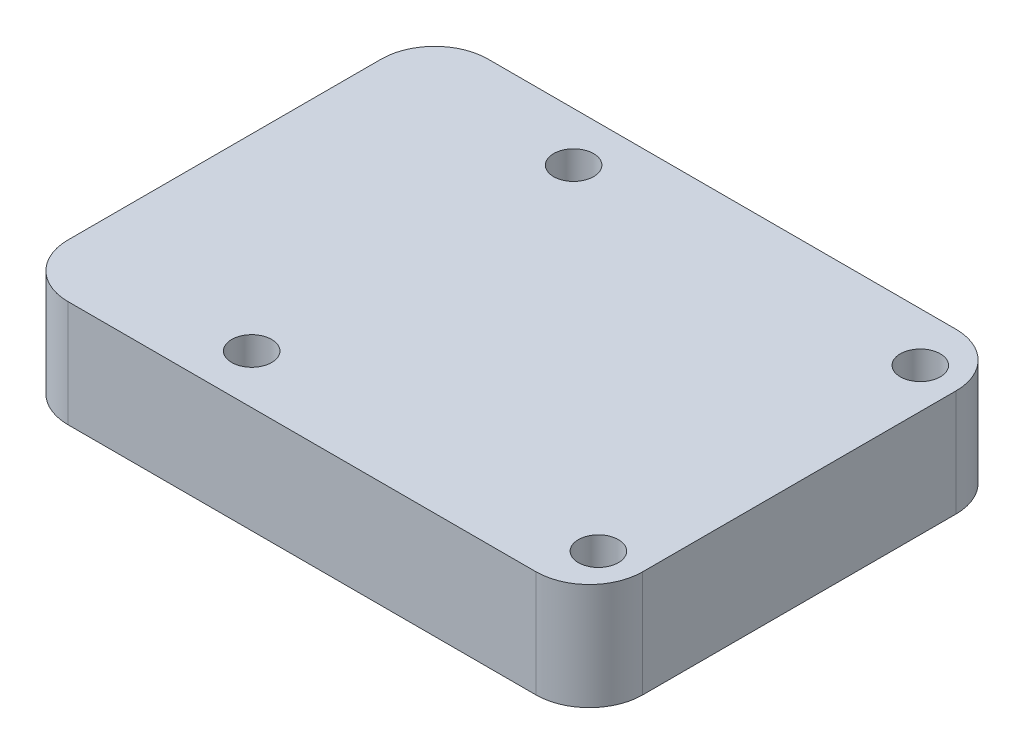
ISO-10303-21;
HEADER;
FILE_DESCRIPTION(('STEP AP214'),'2;1');
FILE_NAME('part.step','',(''),(''),'','','');
FILE_SCHEMA(('AUTOMOTIVE_DESIGN { 1 0 10303 214 1 1 1 1 }'));
ENDSEC;
DATA;
#1=APPLICATION_CONTEXT('core data for automotive mechanical design processes');
#2=APPLICATION_PROTOCOL_DEFINITION('international standard','automotive_design',2000,#1);
#3=PRODUCT_CONTEXT('',#1,'mechanical');
#4=PRODUCT('Part','Part','',(#3));
#5=PRODUCT_RELATED_PRODUCT_CATEGORY('part','',(#4));
#6=PRODUCT_DEFINITION_FORMATION('','',#4);
#7=PRODUCT_DEFINITION_CONTEXT('part definition',#1,'design');
#8=PRODUCT_DEFINITION('design','',#6,#7);
#9=PRODUCT_DEFINITION_SHAPE('','',#8);
#10=(LENGTH_UNIT() NAMED_UNIT(*) SI_UNIT(.MILLI.,.METRE.));
#11=(NAMED_UNIT(*) PLANE_ANGLE_UNIT() SI_UNIT($,.RADIAN.));
#12=(NAMED_UNIT(*) SI_UNIT($,.STERADIAN.) SOLID_ANGLE_UNIT());
#13=UNCERTAINTY_MEASURE_WITH_UNIT(LENGTH_MEASURE(1.E-05),#10,'distance_accuracy_value','');
#14=(GEOMETRIC_REPRESENTATION_CONTEXT(3) GLOBAL_UNCERTAINTY_ASSIGNED_CONTEXT((#13)) GLOBAL_UNIT_ASSIGNED_CONTEXT((#10,
#11,#12)) REPRESENTATION_CONTEXT('',''));
#15=CARTESIAN_POINT('',(0.,0.,0.));
#16=DIRECTION('',(0.,0.,1.));
#17=DIRECTION('',(1.,0.,0.));
#18=AXIS2_PLACEMENT_3D('',#15,#16,#17);
#19=CARTESIAN_POINT('',(0.,8.,0.));
#20=DIRECTION('',(0.,1.,0.));
#21=DIRECTION('',(0.,0.,1.));
#22=AXIS2_PLACEMENT_3D('',#19,#20,#21);
#23=PLANE('',#22);
#24=CARTESIAN_POINT('',(13.,8.,12.07));
#25=DIRECTION('',(0.,1.,0.));
#26=DIRECTION('',(0.,0.,1.));
#27=AXIS2_PLACEMENT_3D('',#24,#25,#26);
#28=CIRCLE('',#27,1.5);
#29=CARTESIAN_POINT('',(13.,8.,13.57));
#30=VERTEX_POINT('',#29);
#31=EDGE_CURVE('E185',#30,#30,#28,.T.);
#32=ORIENTED_EDGE('',*,*,#31,.F.);
#33=EDGE_LOOP('',(#32));
#34=FACE_BOUND('',#33,.T.);
#35=CARTESIAN_POINT('',(-13.,8.,-12.07));
#36=DIRECTION('',(0.,1.,0.));
#37=DIRECTION('',(0.,0.,1.));
#38=AXIS2_PLACEMENT_3D('',#35,#36,#37);
#39=CIRCLE('',#38,1.5);
#40=CARTESIAN_POINT('',(-13.,8.,-10.57));
#41=VERTEX_POINT('',#40);
#42=EDGE_CURVE('E169',#41,#41,#39,.T.);
#43=ORIENTED_EDGE('',*,*,#42,.F.);
#44=EDGE_LOOP('',(#43));
#45=FACE_BOUND('',#44,.T.);
#46=DIRECTION('',(0.,0.,-1.));
#47=VECTOR('',#46,1.);
#48=CARTESIAN_POINT('',(16.,8.,-15.75));
#49=LINE('',#48,#47);
#50=CARTESIAN_POINT('',(16.,8.,11.75));
#51=VERTEX_POINT('',#50);
#52=CARTESIAN_POINT('',(16.,8.,-11.75));
#53=VERTEX_POINT('',#52);
#54=EDGE_CURVE('E173',#51,#53,#49,.T.);
#55=ORIENTED_EDGE('',*,*,#54,.T.);
#56=CARTESIAN_POINT('',(12.,8.,-11.75));
#57=DIRECTION('',(0.,1.,0.));
#58=DIRECTION('',(0.,0.,1.));
#59=AXIS2_PLACEMENT_3D('',#56,#57,#58);
#60=CIRCLE('',#59,4.);
#61=CARTESIAN_POINT('',(12.,8.,-15.75));
#62=VERTEX_POINT('',#61);
#63=EDGE_CURVE('E150',#53,#62,#60,.T.);
#64=ORIENTED_EDGE('',*,*,#63,.T.);
#65=DIRECTION('',(-1.,0.,0.));
#66=VECTOR('',#65,1.);
#67=CARTESIAN_POINT('',(-27.1,8.,-15.75));
#68=LINE('',#67,#66);
#69=CARTESIAN_POINT('',(-23.1,8.,-15.75));
#70=VERTEX_POINT('',#69);
#71=EDGE_CURVE('E121',#62,#70,#68,.T.);
#72=ORIENTED_EDGE('',*,*,#71,.T.);
#73=CARTESIAN_POINT('',(-23.1,8.,-11.75));
#74=DIRECTION('',(0.,1.,0.));
#75=DIRECTION('',(0.,0.,1.));
#76=AXIS2_PLACEMENT_3D('',#73,#74,#75);
#77=CIRCLE('',#76,4.);
#78=CARTESIAN_POINT('',(-27.1,8.,-11.75));
#79=VERTEX_POINT('',#78);
#80=EDGE_CURVE('E146',#70,#79,#77,.T.);
#81=ORIENTED_EDGE('',*,*,#80,.T.);
#82=DIRECTION('',(0.,0.,1.));
#83=VECTOR('',#82,1.);
#84=CARTESIAN_POINT('',(-27.1,8.,-15.75));
#85=LINE('',#84,#83);
#86=CARTESIAN_POINT('',(-27.1,8.,11.75));
#87=VERTEX_POINT('',#86);
#88=EDGE_CURVE('E129',#79,#87,#85,.T.);
#89=ORIENTED_EDGE('',*,*,#88,.T.);
#90=CARTESIAN_POINT('',(-23.1,8.,11.75));
#91=DIRECTION('',(0.,1.,0.));
#92=DIRECTION('',(0.,0.,1.));
#93=AXIS2_PLACEMENT_3D('',#90,#91,#92);
#94=CIRCLE('',#93,4.);
#95=CARTESIAN_POINT('',(-23.1,8.,15.75));
#96=VERTEX_POINT('',#95);
#97=EDGE_CURVE('E56',#87,#96,#94,.T.);
#98=ORIENTED_EDGE('',*,*,#97,.T.);
#99=DIRECTION('',(1.,0.,0.));
#100=VECTOR('',#99,1.);
#101=CARTESIAN_POINT('',(-27.1,8.,15.75));
#102=LINE('',#101,#100);
#103=CARTESIAN_POINT('',(12.,8.,15.75));
#104=VERTEX_POINT('',#103);
#105=EDGE_CURVE('E132',#96,#104,#102,.T.);
#106=ORIENTED_EDGE('',*,*,#105,.T.);
#107=CARTESIAN_POINT('',(12.,8.,11.75));
#108=DIRECTION('',(0.,1.,0.));
#109=DIRECTION('',(0.,0.,1.));
#110=AXIS2_PLACEMENT_3D('',#107,#108,#109);
#111=CIRCLE('',#110,4.);
#112=EDGE_CURVE('E148',#104,#51,#111,.T.);
#113=ORIENTED_EDGE('',*,*,#112,.T.);
#114=EDGE_LOOP('',(#55,#64,#72,#81,#89,#98,#106,#113));
#115=FACE_BOUND('',#114,.T.);
#116=CARTESIAN_POINT('',(13.,8.,-12.07));
#117=DIRECTION('',(0.,1.,0.));
#118=DIRECTION('',(0.,0.,1.));
#119=AXIS2_PLACEMENT_3D('',#116,#117,#118);
#120=CIRCLE('',#119,1.5);
#121=CARTESIAN_POINT('',(13.,8.,-10.57));
#122=VERTEX_POINT('',#121);
#123=EDGE_CURVE('E179',#122,#122,#120,.T.);
#124=ORIENTED_EDGE('',*,*,#123,.F.);
#125=EDGE_LOOP('',(#124));
#126=FACE_BOUND('',#125,.T.);
#127=CARTESIAN_POINT('',(-13.,8.,12.07));
#128=DIRECTION('',(0.,1.,0.));
#129=DIRECTION('',(0.,0.,1.));
#130=AXIS2_PLACEMENT_3D('',#127,#128,#129);
#131=CIRCLE('',#130,1.5);
#132=CARTESIAN_POINT('',(-13.,8.,13.57));
#133=VERTEX_POINT('',#132);
#134=EDGE_CURVE('E191',#133,#133,#131,.T.);
#135=ORIENTED_EDGE('',*,*,#134,.F.);
#136=EDGE_LOOP('',(#135));
#137=FACE_BOUND('',#136,.T.);
#138=ADVANCED_FACE('F34',(#34,#45,#115,#126,#137),#23,.T.);
#139=CARTESIAN_POINT('',(0.,0.,0.));
#140=DIRECTION('',(0.,1.,0.));
#141=DIRECTION('',(0.,0.,1.));
#142=AXIS2_PLACEMENT_3D('',#139,#140,#141);
#143=PLANE('',#142);
#144=DIRECTION('',(-1.,0.,0.));
#145=VECTOR('',#144,1.);
#146=CARTESIAN_POINT('',(-27.1,0.,-15.75));
#147=LINE('',#146,#145);
#148=CARTESIAN_POINT('',(12.,0.,-15.75));
#149=VERTEX_POINT('',#148);
#150=CARTESIAN_POINT('',(-23.1,0.,-15.75));
#151=VERTEX_POINT('',#150);
#152=EDGE_CURVE('E118',#149,#151,#147,.T.);
#153=ORIENTED_EDGE('',*,*,#152,.F.);
#154=CARTESIAN_POINT('',(12.,0.,-11.75));
#155=DIRECTION('',(0.,1.,0.));
#156=DIRECTION('',(0.,0.,1.));
#157=AXIS2_PLACEMENT_3D('',#154,#155,#156);
#158=CIRCLE('',#157,4.);
#159=CARTESIAN_POINT('',(16.,0.,-11.75));
#160=VERTEX_POINT('',#159);
#161=EDGE_CURVE('E101',#149,#160,#158,.F.);
#162=ORIENTED_EDGE('',*,*,#161,.T.);
#163=DIRECTION('',(0.,0.,-1.));
#164=VECTOR('',#163,1.);
#165=CARTESIAN_POINT('',(16.,0.,-15.75));
#166=LINE('',#165,#164);
#167=CARTESIAN_POINT('',(16.,0.,11.75));
#168=VERTEX_POINT('',#167);
#169=EDGE_CURVE('E130',#168,#160,#166,.T.);
#170=ORIENTED_EDGE('',*,*,#169,.F.);
#171=CARTESIAN_POINT('',(12.,0.,11.75));
#172=DIRECTION('',(0.,1.,0.));
#173=DIRECTION('',(0.,0.,1.));
#174=AXIS2_PLACEMENT_3D('',#171,#172,#173);
#175=CIRCLE('',#174,4.);
#176=CARTESIAN_POINT('',(12.,0.,15.75));
#177=VERTEX_POINT('',#176);
#178=EDGE_CURVE('E112',#168,#177,#175,.F.);
#179=ORIENTED_EDGE('',*,*,#178,.T.);
#180=DIRECTION('',(1.,0.,0.));
#181=VECTOR('',#180,1.);
#182=CARTESIAN_POINT('',(-27.1,0.,15.75));
#183=LINE('',#182,#181);
#184=CARTESIAN_POINT('',(-23.1,0.,15.75));
#185=VERTEX_POINT('',#184);
#186=EDGE_CURVE('E134',#185,#177,#183,.T.);
#187=ORIENTED_EDGE('',*,*,#186,.F.);
#188=CARTESIAN_POINT('',(-23.1,0.,11.75));
#189=DIRECTION('',(0.,1.,0.));
#190=DIRECTION('',(0.,0.,1.));
#191=AXIS2_PLACEMENT_3D('',#188,#189,#190);
#192=CIRCLE('',#191,4.);
#193=CARTESIAN_POINT('',(-27.1,0.,11.75));
#194=VERTEX_POINT('',#193);
#195=EDGE_CURVE('E122',#185,#194,#192,.F.);
#196=ORIENTED_EDGE('',*,*,#195,.T.);
#197=DIRECTION('',(0.,0.,1.));
#198=VECTOR('',#197,1.);
#199=CARTESIAN_POINT('',(-27.1,0.,-15.75));
#200=LINE('',#199,#198);
#201=CARTESIAN_POINT('',(-27.1,0.,-11.75));
#202=VERTEX_POINT('',#201);
#203=EDGE_CURVE('E161',#202,#194,#200,.T.);
#204=ORIENTED_EDGE('',*,*,#203,.F.);
#205=CARTESIAN_POINT('',(-23.1,0.,-11.75));
#206=DIRECTION('',(0.,1.,0.));
#207=DIRECTION('',(0.,0.,1.));
#208=AXIS2_PLACEMENT_3D('',#205,#206,#207);
#209=CIRCLE('',#208,4.);
#210=EDGE_CURVE('E128',#202,#151,#209,.F.);
#211=ORIENTED_EDGE('',*,*,#210,.T.);
#212=EDGE_LOOP('',(#153,#162,#170,#179,#187,#196,#204,#211));
#213=FACE_BOUND('',#212,.T.);
#214=CARTESIAN_POINT('',(-13.,0.,-12.07));
#215=DIRECTION('',(0.,1.,0.));
#216=DIRECTION('',(0.,0.,1.));
#217=AXIS2_PLACEMENT_3D('',#214,#215,#216);
#218=CIRCLE('',#217,1.5);
#219=CARTESIAN_POINT('',(-13.,0.,-10.57));
#220=VERTEX_POINT('',#219);
#221=EDGE_CURVE('E176',#220,#220,#218,.T.);
#222=ORIENTED_EDGE('',*,*,#221,.T.);
#223=EDGE_LOOP('',(#222));
#224=FACE_BOUND('',#223,.T.);
#225=CARTESIAN_POINT('',(13.,0.,-12.07));
#226=DIRECTION('',(0.,1.,0.));
#227=DIRECTION('',(0.,0.,1.));
#228=AXIS2_PLACEMENT_3D('',#225,#226,#227);
#229=CIRCLE('',#228,1.5);
#230=CARTESIAN_POINT('',(13.,0.,-10.57));
#231=VERTEX_POINT('',#230);
#232=EDGE_CURVE('E182',#231,#231,#229,.T.);
#233=ORIENTED_EDGE('',*,*,#232,.T.);
#234=EDGE_LOOP('',(#233));
#235=FACE_BOUND('',#234,.T.);
#236=CARTESIAN_POINT('',(13.,0.,12.07));
#237=DIRECTION('',(0.,1.,0.));
#238=DIRECTION('',(0.,0.,1.));
#239=AXIS2_PLACEMENT_3D('',#236,#237,#238);
#240=CIRCLE('',#239,1.5);
#241=CARTESIAN_POINT('',(13.,0.,13.57));
#242=VERTEX_POINT('',#241);
#243=EDGE_CURVE('E188',#242,#242,#240,.T.);
#244=ORIENTED_EDGE('',*,*,#243,.T.);
#245=EDGE_LOOP('',(#244));
#246=FACE_BOUND('',#245,.T.);
#247=CARTESIAN_POINT('',(-13.,0.,12.07));
#248=DIRECTION('',(0.,1.,0.));
#249=DIRECTION('',(0.,0.,1.));
#250=AXIS2_PLACEMENT_3D('',#247,#248,#249);
#251=CIRCLE('',#250,1.5);
#252=CARTESIAN_POINT('',(-13.,0.,13.57));
#253=VERTEX_POINT('',#252);
#254=EDGE_CURVE('E194',#253,#253,#251,.T.);
#255=ORIENTED_EDGE('',*,*,#254,.T.);
#256=EDGE_LOOP('',(#255));
#257=FACE_BOUND('',#256,.T.);
#258=ADVANCED_FACE('F125',(#213,#224,#235,#246,#257),#143,.F.);
#259=CARTESIAN_POINT('',(-27.1,8.,-15.75));
#260=DIRECTION('',(1.,0.,0.));
#261=DIRECTION('',(0.,0.,-1.));
#262=AXIS2_PLACEMENT_3D('',#259,#260,#261);
#263=PLANE('',#262);
#264=ORIENTED_EDGE('',*,*,#88,.F.);
#265=DIRECTION('',(0.,-1.,0.));
#266=VECTOR('',#265,1.);
#267=CARTESIAN_POINT('',(-27.1,8.,-11.75));
#268=LINE('',#267,#266);
#269=EDGE_CURVE('E11',#79,#202,#268,.T.);
#270=ORIENTED_EDGE('',*,*,#269,.T.);
#271=ORIENTED_EDGE('',*,*,#203,.T.);
#272=DIRECTION('',(0.,-1.,0.));
#273=VECTOR('',#272,1.);
#274=CARTESIAN_POINT('',(-27.1,8.,11.75));
#275=LINE('',#274,#273);
#276=EDGE_CURVE('E42',#194,#87,#275,.F.);
#277=ORIENTED_EDGE('',*,*,#276,.T.);
#278=EDGE_LOOP('',(#264,#270,#271,#277));
#279=FACE_BOUND('',#278,.T.);
#280=ADVANCED_FACE('F159',(#279),#263,.F.);
#281=CARTESIAN_POINT('',(-27.1,8.,15.75));
#282=DIRECTION('',(0.,0.,-1.));
#283=DIRECTION('',(-1.,0.,0.));
#284=AXIS2_PLACEMENT_3D('',#281,#282,#283);
#285=PLANE('',#284);
#286=ORIENTED_EDGE('',*,*,#186,.T.);
#287=DIRECTION('',(0.,-1.,0.));
#288=VECTOR('',#287,1.);
#289=CARTESIAN_POINT('',(12.,8.,15.75));
#290=LINE('',#289,#288);
#291=EDGE_CURVE('E49',#177,#104,#290,.F.);
#292=ORIENTED_EDGE('',*,*,#291,.T.);
#293=ORIENTED_EDGE('',*,*,#105,.F.);
#294=DIRECTION('',(0.,-1.,0.));
#295=VECTOR('',#294,1.);
#296=CARTESIAN_POINT('',(-23.1,8.,15.75));
#297=LINE('',#296,#295);
#298=EDGE_CURVE('E152',#96,#185,#297,.T.);
#299=ORIENTED_EDGE('',*,*,#298,.T.);
#300=EDGE_LOOP('',(#286,#292,#293,#299));
#301=FACE_BOUND('',#300,.T.);
#302=ADVANCED_FACE('F168',(#301),#285,.F.);
#303=CARTESIAN_POINT('',(16.,8.,-15.75));
#304=DIRECTION('',(-1.,0.,0.));
#305=DIRECTION('',(0.,0.,1.));
#306=AXIS2_PLACEMENT_3D('',#303,#304,#305);
#307=PLANE('',#306);
#308=ORIENTED_EDGE('',*,*,#169,.T.);
#309=DIRECTION('',(0.,-1.,0.));
#310=VECTOR('',#309,1.);
#311=CARTESIAN_POINT('',(16.,8.,-11.75));
#312=LINE('',#311,#310);
#313=EDGE_CURVE('E106',#160,#53,#312,.F.);
#314=ORIENTED_EDGE('',*,*,#313,.T.);
#315=ORIENTED_EDGE('',*,*,#54,.F.);
#316=DIRECTION('',(0.,-1.,0.));
#317=VECTOR('',#316,1.);
#318=CARTESIAN_POINT('',(16.,8.,11.75));
#319=LINE('',#318,#317);
#320=EDGE_CURVE('E111',#51,#168,#319,.T.);
#321=ORIENTED_EDGE('',*,*,#320,.T.);
#322=EDGE_LOOP('',(#308,#314,#315,#321));
#323=FACE_BOUND('',#322,.T.);
#324=ADVANCED_FACE('F218',(#323),#307,.F.);
#325=CARTESIAN_POINT('',(-27.1,8.,-15.75));
#326=DIRECTION('',(0.,0.,1.));
#327=DIRECTION('',(1.,0.,0.));
#328=AXIS2_PLACEMENT_3D('',#325,#326,#327);
#329=PLANE('',#328);
#330=ORIENTED_EDGE('',*,*,#71,.F.);
#331=DIRECTION('',(0.,-1.,0.));
#332=VECTOR('',#331,1.);
#333=CARTESIAN_POINT('',(12.,8.,-15.75));
#334=LINE('',#333,#332);
#335=EDGE_CURVE('E105',#62,#149,#334,.T.);
#336=ORIENTED_EDGE('',*,*,#335,.T.);
#337=ORIENTED_EDGE('',*,*,#152,.T.);
#338=DIRECTION('',(0.,-1.,0.));
#339=VECTOR('',#338,1.);
#340=CARTESIAN_POINT('',(-23.1,8.,-15.75));
#341=LINE('',#340,#339);
#342=EDGE_CURVE('E123',#151,#70,#341,.F.);
#343=ORIENTED_EDGE('',*,*,#342,.T.);
#344=EDGE_LOOP('',(#330,#336,#337,#343));
#345=FACE_BOUND('',#344,.T.);
#346=ADVANCED_FACE('F117',(#345),#329,.F.);
#347=CARTESIAN_POINT('',(-13.,8.,-12.07));
#348=DIRECTION('',(0.,-1.,0.));
#349=DIRECTION('',(0.,0.,-1.));
#350=AXIS2_PLACEMENT_3D('',#347,#348,#349);
#351=CYLINDRICAL_SURFACE('',#350,1.5);
#352=ORIENTED_EDGE('',*,*,#42,.T.);
#353=EDGE_LOOP('',(#352));
#354=FACE_BOUND('',#353,.T.);
#355=ORIENTED_EDGE('',*,*,#221,.F.);
#356=EDGE_LOOP('',(#355));
#357=FACE_BOUND('',#356,.T.);
#358=ADVANCED_FACE('F213',(#354,#357),#351,.F.);
#359=CARTESIAN_POINT('',(13.,8.,-12.07));
#360=DIRECTION('',(0.,-1.,0.));
#361=DIRECTION('',(0.,0.,-1.));
#362=AXIS2_PLACEMENT_3D('',#359,#360,#361);
#363=CYLINDRICAL_SURFACE('',#362,1.5);
#364=ORIENTED_EDGE('',*,*,#123,.T.);
#365=EDGE_LOOP('',(#364));
#366=FACE_BOUND('',#365,.T.);
#367=ORIENTED_EDGE('',*,*,#232,.F.);
#368=EDGE_LOOP('',(#367));
#369=FACE_BOUND('',#368,.T.);
#370=ADVANCED_FACE('F312',(#366,#369),#363,.F.);
#371=CARTESIAN_POINT('',(13.,8.,12.07));
#372=DIRECTION('',(0.,-1.,0.));
#373=DIRECTION('',(0.,0.,-1.));
#374=AXIS2_PLACEMENT_3D('',#371,#372,#373);
#375=CYLINDRICAL_SURFACE('',#374,1.5);
#376=ORIENTED_EDGE('',*,*,#31,.T.);
#377=EDGE_LOOP('',(#376));
#378=FACE_BOUND('',#377,.T.);
#379=ORIENTED_EDGE('',*,*,#243,.F.);
#380=EDGE_LOOP('',(#379));
#381=FACE_BOUND('',#380,.T.);
#382=ADVANCED_FACE('F303',(#378,#381),#375,.F.);
#383=CARTESIAN_POINT('',(-13.,8.,12.07));
#384=DIRECTION('',(0.,-1.,0.));
#385=DIRECTION('',(0.,0.,-1.));
#386=AXIS2_PLACEMENT_3D('',#383,#384,#385);
#387=CYLINDRICAL_SURFACE('',#386,1.5);
#388=ORIENTED_EDGE('',*,*,#134,.T.);
#389=EDGE_LOOP('',(#388));
#390=FACE_BOUND('',#389,.T.);
#391=ORIENTED_EDGE('',*,*,#254,.F.);
#392=EDGE_LOOP('',(#391));
#393=FACE_BOUND('',#392,.T.);
#394=ADVANCED_FACE('F200',(#390,#393),#387,.F.);
#395=CARTESIAN_POINT('',(12.,8.,-11.75));
#396=DIRECTION('',(0.,-1.,0.));
#397=DIRECTION('',(0.,0.,-1.));
#398=AXIS2_PLACEMENT_3D('',#395,#396,#397);
#399=CYLINDRICAL_SURFACE('',#398,4.);
#400=ORIENTED_EDGE('',*,*,#63,.F.);
#401=ORIENTED_EDGE('',*,*,#313,.F.);
#402=ORIENTED_EDGE('',*,*,#161,.F.);
#403=ORIENTED_EDGE('',*,*,#335,.F.);
#404=EDGE_LOOP('',(#400,#401,#402,#403));
#405=FACE_BOUND('',#404,.T.);
#406=ADVANCED_FACE('F104',(#405),#399,.T.);
#407=CARTESIAN_POINT('',(12.,8.,11.75));
#408=DIRECTION('',(0.,-1.,0.));
#409=DIRECTION('',(0.,0.,-1.));
#410=AXIS2_PLACEMENT_3D('',#407,#408,#409);
#411=CYLINDRICAL_SURFACE('',#410,4.);
#412=ORIENTED_EDGE('',*,*,#112,.F.);
#413=ORIENTED_EDGE('',*,*,#291,.F.);
#414=ORIENTED_EDGE('',*,*,#178,.F.);
#415=ORIENTED_EDGE('',*,*,#320,.F.);
#416=EDGE_LOOP('',(#412,#413,#414,#415));
#417=FACE_BOUND('',#416,.T.);
#418=ADVANCED_FACE('F228',(#417),#411,.T.);
#419=CARTESIAN_POINT('',(-23.1,8.,-11.75));
#420=DIRECTION('',(0.,-1.,0.));
#421=DIRECTION('',(0.,0.,-1.));
#422=AXIS2_PLACEMENT_3D('',#419,#420,#421);
#423=CYLINDRICAL_SURFACE('',#422,4.);
#424=ORIENTED_EDGE('',*,*,#80,.F.);
#425=ORIENTED_EDGE('',*,*,#342,.F.);
#426=ORIENTED_EDGE('',*,*,#210,.F.);
#427=ORIENTED_EDGE('',*,*,#269,.F.);
#428=EDGE_LOOP('',(#424,#425,#426,#427));
#429=FACE_BOUND('',#428,.T.);
#430=ADVANCED_FACE('F230',(#429),#423,.T.);
#431=CARTESIAN_POINT('',(-23.1,8.,11.75));
#432=DIRECTION('',(0.,-1.,0.));
#433=DIRECTION('',(0.,0.,-1.));
#434=AXIS2_PLACEMENT_3D('',#431,#432,#433);
#435=CYLINDRICAL_SURFACE('',#434,4.);
#436=ORIENTED_EDGE('',*,*,#97,.F.);
#437=ORIENTED_EDGE('',*,*,#276,.F.);
#438=ORIENTED_EDGE('',*,*,#195,.F.);
#439=ORIENTED_EDGE('',*,*,#298,.F.);
#440=EDGE_LOOP('',(#436,#437,#438,#439));
#441=FACE_BOUND('',#440,.T.);
#442=ADVANCED_FACE('F36',(#441),#435,.T.);
#443=CLOSED_SHELL('',(#138,#258,#280,#302,#324,#346,#358,#370,#382,#394,#406,#418,#430,#442));
#444=MANIFOLD_SOLID_BREP('B2',#443);
#445=ADVANCED_BREP_SHAPE_REPRESENTATION('',(#18,#444),#14);
#446=SHAPE_DEFINITION_REPRESENTATION(#9,#445);
ENDSEC;
END-ISO-10303-21;
